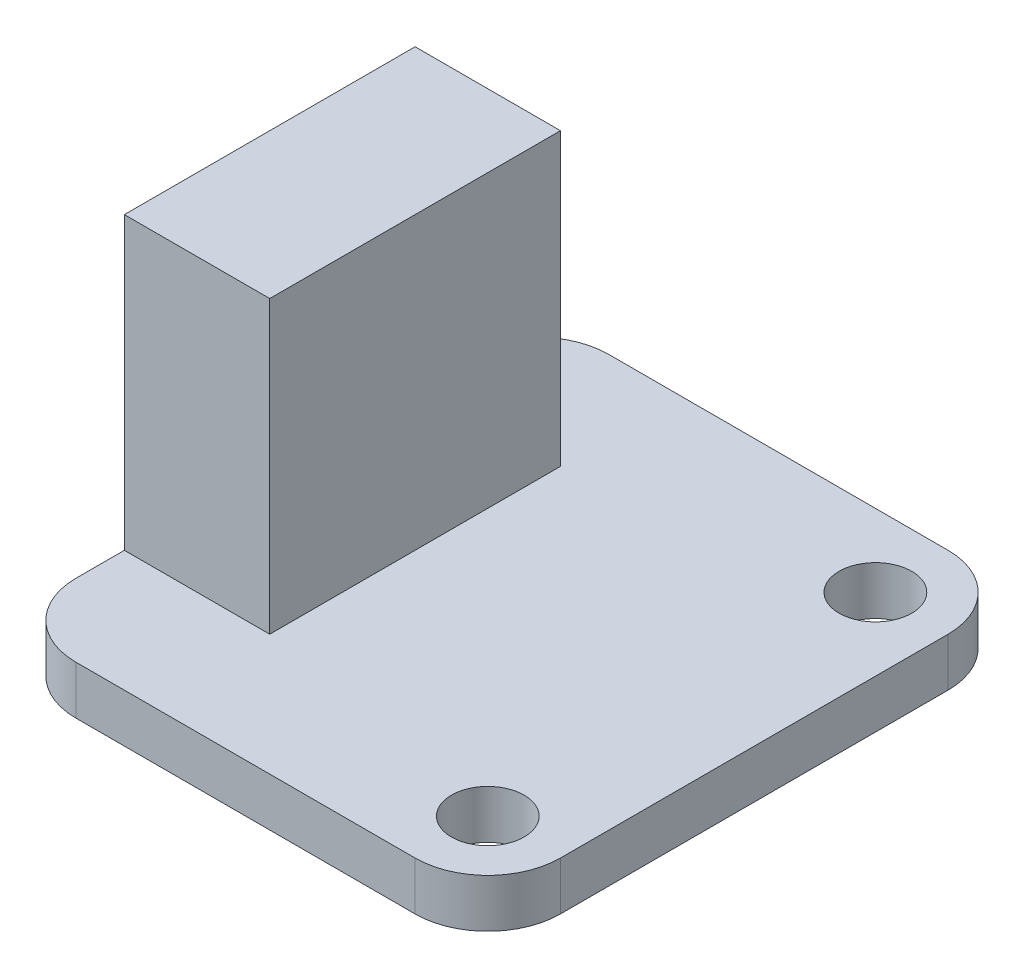
ISO-10303-21;
HEADER;
FILE_DESCRIPTION(('STEP AP214'),'2;1');
FILE_NAME('part.step','',(''),(''),'','','');
FILE_SCHEMA(('AUTOMOTIVE_DESIGN { 1 0 10303 214 1 1 1 1 }'));
ENDSEC;
DATA;
#1=APPLICATION_CONTEXT('core data for automotive mechanical design processes');
#2=APPLICATION_PROTOCOL_DEFINITION('international standard','automotive_design',2000,#1);
#3=PRODUCT_CONTEXT('',#1,'mechanical');
#4=PRODUCT('Part','Part','',(#3));
#5=PRODUCT_RELATED_PRODUCT_CATEGORY('part','',(#4));
#6=PRODUCT_DEFINITION_FORMATION('','',#4);
#7=PRODUCT_DEFINITION_CONTEXT('part definition',#1,'design');
#8=PRODUCT_DEFINITION('design','',#6,#7);
#9=PRODUCT_DEFINITION_SHAPE('','',#8);
#10=(LENGTH_UNIT() NAMED_UNIT(*) SI_UNIT(.MILLI.,.METRE.));
#11=(NAMED_UNIT(*) PLANE_ANGLE_UNIT() SI_UNIT($,.RADIAN.));
#12=(NAMED_UNIT(*) SI_UNIT($,.STERADIAN.) SOLID_ANGLE_UNIT());
#13=UNCERTAINTY_MEASURE_WITH_UNIT(LENGTH_MEASURE(1.E-05),#10,'distance_accuracy_value','');
#14=(GEOMETRIC_REPRESENTATION_CONTEXT(3) GLOBAL_UNCERTAINTY_ASSIGNED_CONTEXT((#13)) GLOBAL_UNIT_ASSIGNED_CONTEXT((#10,
#11,#12)) REPRESENTATION_CONTEXT('',''));
#15=CARTESIAN_POINT('',(0.,0.,0.));
#16=DIRECTION('',(0.,0.,1.));
#17=DIRECTION('',(1.,0.,0.));
#18=AXIS2_PLACEMENT_3D('',#15,#16,#17);
#19=CARTESIAN_POINT('',(7.00000000000002,0.,-8.));
#20=DIRECTION('',(0.,1.,0.));
#21=DIRECTION('',(0.,0.,1.));
#22=AXIS2_PLACEMENT_3D('',#19,#20,#21);
#23=PLANE('',#22);
#24=CARTESIAN_POINT('',(7.00000000000001,0.,8.));
#25=DIRECTION('',(0.,1.,0.));
#26=DIRECTION('',(0.,0.,1.));
#27=AXIS2_PLACEMENT_3D('',#24,#25,#26);
#28=CIRCLE('',#27,1.50000000000002);
#29=CARTESIAN_POINT('',(7.00000000000001,0.,9.50000000000003));
#30=VERTEX_POINT('',#29);
#31=EDGE_CURVE('E204',#30,#30,#28,.T.);
#32=ORIENTED_EDGE('',*,*,#31,.T.);
#33=EDGE_LOOP('',(#32));
#34=FACE_BOUND('',#33,.T.);
#35=CARTESIAN_POINT('',(7.00000000000001,0.,-8.));
#36=DIRECTION('',(0.,1.,0.));
#37=DIRECTION('',(0.,0.,1.));
#38=AXIS2_PLACEMENT_3D('',#35,#36,#37);
#39=CIRCLE('',#38,1.50000000000002);
#40=CARTESIAN_POINT('',(7.00000000000001,0.,-6.49999999999997));
#41=VERTEX_POINT('',#40);
#42=EDGE_CURVE('E208',#41,#41,#39,.T.);
#43=ORIENTED_EDGE('',*,*,#42,.T.);
#44=EDGE_LOOP('',(#43));
#45=FACE_BOUND('',#44,.T.);
#46=CARTESIAN_POINT('',(7.00000000000002,0.,-8.));
#47=DIRECTION('',(0.,1.,0.));
#48=DIRECTION('',(0.,0.,1.));
#49=AXIS2_PLACEMENT_3D('',#46,#47,#48);
#50=CIRCLE('',#49,3.);
#51=CARTESIAN_POINT('',(10.,0.,-7.99999999999998));
#52=VERTEX_POINT('',#51);
#53=CARTESIAN_POINT('',(7.,0.,-11.));
#54=VERTEX_POINT('',#53);
#55=EDGE_CURVE('E214',#52,#54,#50,.T.);
#56=ORIENTED_EDGE('',*,*,#55,.F.);
#57=DIRECTION('',(0.,0.,-1.));
#58=VECTOR('',#57,1.);
#59=CARTESIAN_POINT('',(10.,0.,-7.99999999999998));
#60=LINE('',#59,#58);
#61=CARTESIAN_POINT('',(10.0000000000001,0.,7.99999999999997));
#62=VERTEX_POINT('',#61);
#63=EDGE_CURVE('E221',#62,#52,#60,.T.);
#64=ORIENTED_EDGE('',*,*,#63,.F.);
#65=CARTESIAN_POINT('',(7.00000000000006,0.,8.));
#66=DIRECTION('',(0.,1.,0.));
#67=DIRECTION('',(0.,0.,1.));
#68=AXIS2_PLACEMENT_3D('',#65,#66,#67);
#69=CIRCLE('',#68,3.);
#70=CARTESIAN_POINT('',(7.00000000000003,0.,11.));
#71=VERTEX_POINT('',#70);
#72=EDGE_CURVE('E249',#71,#62,#69,.T.);
#73=ORIENTED_EDGE('',*,*,#72,.F.);
#74=DIRECTION('',(1.,0.,0.));
#75=VECTOR('',#74,1.);
#76=CARTESIAN_POINT('',(-6.99999999999999,0.,11.));
#77=LINE('',#76,#75);
#78=CARTESIAN_POINT('',(-6.99999999999999,0.,11.));
#79=VERTEX_POINT('',#78);
#80=EDGE_CURVE('E247',#79,#71,#77,.T.);
#81=ORIENTED_EDGE('',*,*,#80,.F.);
#82=CARTESIAN_POINT('',(-7.00000000000001,0.,8.));
#83=DIRECTION('',(0.,1.,0.));
#84=DIRECTION('',(0.,0.,1.));
#85=AXIS2_PLACEMENT_3D('',#82,#83,#84);
#86=CIRCLE('',#85,3.);
#87=CARTESIAN_POINT('',(-10.,0.,7.99999999999998));
#88=VERTEX_POINT('',#87);
#89=EDGE_CURVE('E245',#88,#79,#86,.T.);
#90=ORIENTED_EDGE('',*,*,#89,.F.);
#91=DIRECTION('',(0.,0.,1.));
#92=VECTOR('',#91,1.);
#93=CARTESIAN_POINT('',(-10.,0.,-7.99999999999997));
#94=LINE('',#93,#92);
#95=CARTESIAN_POINT('',(-10.,0.,-7.99999999999997));
#96=VERTEX_POINT('',#95);
#97=EDGE_CURVE('E243',#96,#88,#94,.T.);
#98=ORIENTED_EDGE('',*,*,#97,.F.);
#99=CARTESIAN_POINT('',(-7.00000000000001,0.,-8.));
#100=DIRECTION('',(0.,1.,0.));
#101=DIRECTION('',(0.,0.,1.));
#102=AXIS2_PLACEMENT_3D('',#99,#100,#101);
#103=CIRCLE('',#102,3.);
#104=CARTESIAN_POINT('',(-6.99999999999999,0.,-11.));
#105=VERTEX_POINT('',#104);
#106=EDGE_CURVE('E241',#105,#96,#103,.T.);
#107=ORIENTED_EDGE('',*,*,#106,.F.);
#108=DIRECTION('',(-1.,0.,0.));
#109=VECTOR('',#108,1.);
#110=CARTESIAN_POINT('',(-6.99999999999999,0.,-11.));
#111=LINE('',#110,#109);
#112=EDGE_CURVE('E239',#54,#105,#111,.T.);
#113=ORIENTED_EDGE('',*,*,#112,.F.);
#114=EDGE_LOOP('',(#56,#64,#73,#81,#90,#98,#107,#113));
#115=FACE_BOUND('',#114,.T.);
#116=DIRECTION('',(0.,0.,1.));
#117=VECTOR('',#116,1.);
#118=CARTESIAN_POINT('',(3.00000000000006,0.,2.));
#119=LINE('',#118,#117);
#120=CARTESIAN_POINT('',(3.00000000000006,0.,-2.));
#121=VERTEX_POINT('',#120);
#122=CARTESIAN_POINT('',(3.00000000000006,0.,2.));
#123=VERTEX_POINT('',#122);
#124=EDGE_CURVE('E168',#121,#123,#119,.T.);
#125=ORIENTED_EDGE('',*,*,#124,.F.);
#126=DIRECTION('',(1.,0.,0.));
#127=VECTOR('',#126,1.);
#128=CARTESIAN_POINT('',(1.00000000000006,0.,-2.));
#129=LINE('',#128,#127);
#130=CARTESIAN_POINT('',(1.00000000000006,0.,-2.));
#131=VERTEX_POINT('',#130);
#132=EDGE_CURVE('E165',#131,#121,#129,.T.);
#133=ORIENTED_EDGE('',*,*,#132,.F.);
#134=DIRECTION('',(0.,0.,-1.));
#135=VECTOR('',#134,1.);
#136=CARTESIAN_POINT('',(1.00000000000006,0.,2.));
#137=LINE('',#136,#135);
#138=CARTESIAN_POINT('',(1.00000000000006,0.,2.));
#139=VERTEX_POINT('',#138);
#140=EDGE_CURVE('E55',#139,#131,#137,.T.);
#141=ORIENTED_EDGE('',*,*,#140,.F.);
#142=DIRECTION('',(-1.,0.,0.));
#143=VECTOR('',#142,1.);
#144=CARTESIAN_POINT('',(1.00000000000006,0.,2.));
#145=LINE('',#144,#143);
#146=EDGE_CURVE('E50',#123,#139,#145,.T.);
#147=ORIENTED_EDGE('',*,*,#146,.F.);
#148=EDGE_LOOP('',(#125,#133,#141,#147));
#149=FACE_BOUND('',#148,.T.);
#150=ADVANCED_FACE('F35',(#34,#45,#115,#149),#23,.F.);
#151=CARTESIAN_POINT('',(7.00000000000002,2.,-8.));
#152=DIRECTION('',(0.,1.,0.));
#153=DIRECTION('',(0.,0.,1.));
#154=AXIS2_PLACEMENT_3D('',#151,#152,#153);
#155=PLANE('',#154);
#156=DIRECTION('',(1.,0.,0.));
#157=VECTOR('',#156,1.);
#158=CARTESIAN_POINT('',(-10.,2.,6.));
#159=LINE('',#158,#157);
#160=CARTESIAN_POINT('',(-10.,2.,6.));
#161=VERTEX_POINT('',#160);
#162=CARTESIAN_POINT('',(-4.00000000000001,2.,6.));
#163=VERTEX_POINT('',#162);
#164=EDGE_CURVE('E182',#161,#163,#159,.T.);
#165=ORIENTED_EDGE('',*,*,#164,.F.);
#166=DIRECTION('',(0.,0.,1.));
#167=VECTOR('',#166,1.);
#168=CARTESIAN_POINT('',(-10.,2.,-7.99999999999997));
#169=LINE('',#168,#167);
#170=CARTESIAN_POINT('',(-10.,2.,7.99999999999998));
#171=VERTEX_POINT('',#170);
#172=EDGE_CURVE('E225',#161,#171,#169,.T.);
#173=ORIENTED_EDGE('',*,*,#172,.T.);
#174=CARTESIAN_POINT('',(-7.00000000000001,2.,8.));
#175=DIRECTION('',(0.,1.,0.));
#176=DIRECTION('',(0.,0.,1.));
#177=AXIS2_PLACEMENT_3D('',#174,#175,#176);
#178=CIRCLE('',#177,3.);
#179=CARTESIAN_POINT('',(-6.99999999999999,2.,11.));
#180=VERTEX_POINT('',#179);
#181=EDGE_CURVE('E228',#171,#180,#178,.T.);
#182=ORIENTED_EDGE('',*,*,#181,.T.);
#183=DIRECTION('',(1.,0.,0.));
#184=VECTOR('',#183,1.);
#185=CARTESIAN_POINT('',(-6.99999999999999,2.,11.));
#186=LINE('',#185,#184);
#187=CARTESIAN_POINT('',(7.00000000000003,2.,11.));
#188=VERTEX_POINT('',#187);
#189=EDGE_CURVE('E230',#180,#188,#186,.T.);
#190=ORIENTED_EDGE('',*,*,#189,.T.);
#191=CARTESIAN_POINT('',(7.00000000000006,2.,8.));
#192=DIRECTION('',(0.,1.,0.));
#193=DIRECTION('',(0.,0.,1.));
#194=AXIS2_PLACEMENT_3D('',#191,#192,#193);
#195=CIRCLE('',#194,3.);
#196=CARTESIAN_POINT('',(10.0000000000001,2.,7.99999999999997));
#197=VERTEX_POINT('',#196);
#198=EDGE_CURVE('E232',#188,#197,#195,.T.);
#199=ORIENTED_EDGE('',*,*,#198,.T.);
#200=DIRECTION('',(0.,0.,-1.));
#201=VECTOR('',#200,1.);
#202=CARTESIAN_POINT('',(10.,2.,-7.99999999999998));
#203=LINE('',#202,#201);
#204=CARTESIAN_POINT('',(10.,2.,-7.99999999999998));
#205=VERTEX_POINT('',#204);
#206=EDGE_CURVE('E234',#197,#205,#203,.T.);
#207=ORIENTED_EDGE('',*,*,#206,.T.);
#208=CARTESIAN_POINT('',(7.00000000000002,2.,-8.));
#209=DIRECTION('',(0.,1.,0.));
#210=DIRECTION('',(0.,0.,1.));
#211=AXIS2_PLACEMENT_3D('',#208,#209,#210);
#212=CIRCLE('',#211,3.);
#213=CARTESIAN_POINT('',(7.,2.,-11.));
#214=VERTEX_POINT('',#213);
#215=EDGE_CURVE('E217',#205,#214,#212,.T.);
#216=ORIENTED_EDGE('',*,*,#215,.T.);
#217=DIRECTION('',(-1.,0.,0.));
#218=VECTOR('',#217,1.);
#219=CARTESIAN_POINT('',(-6.99999999999999,2.,-11.));
#220=LINE('',#219,#218);
#221=CARTESIAN_POINT('',(-6.99999999999999,2.,-11.));
#222=VERTEX_POINT('',#221);
#223=EDGE_CURVE('E220',#214,#222,#220,.T.);
#224=ORIENTED_EDGE('',*,*,#223,.T.);
#225=CARTESIAN_POINT('',(-7.00000000000001,2.,-8.));
#226=DIRECTION('',(0.,1.,0.));
#227=DIRECTION('',(0.,0.,1.));
#228=AXIS2_PLACEMENT_3D('',#225,#226,#227);
#229=CIRCLE('',#228,3.);
#230=CARTESIAN_POINT('',(-10.,2.,-7.99999999999997));
#231=VERTEX_POINT('',#230);
#232=EDGE_CURVE('E223',#222,#231,#229,.T.);
#233=ORIENTED_EDGE('',*,*,#232,.T.);
#234=CARTESIAN_POINT('',(-10.,2.,-6.));
#235=VERTEX_POINT('',#234);
#236=EDGE_CURVE('E226',#231,#235,#169,.T.);
#237=ORIENTED_EDGE('',*,*,#236,.T.);
#238=DIRECTION('',(-1.,0.,0.));
#239=VECTOR('',#238,1.);
#240=CARTESIAN_POINT('',(-10.,2.,-6.));
#241=LINE('',#240,#239);
#242=CARTESIAN_POINT('',(-4.00000000000001,2.,-6.));
#243=VERTEX_POINT('',#242);
#244=EDGE_CURVE('E172',#243,#235,#241,.T.);
#245=ORIENTED_EDGE('',*,*,#244,.F.);
#246=DIRECTION('',(0.,0.,-1.));
#247=VECTOR('',#246,1.);
#248=CARTESIAN_POINT('',(-4.00000000000001,2.,-6.));
#249=LINE('',#248,#247);
#250=EDGE_CURVE('E169',#163,#243,#249,.T.);
#251=ORIENTED_EDGE('',*,*,#250,.F.);
#252=EDGE_LOOP('',(#165,#173,#182,#190,#199,#207,#216,#224,#233,#237,#245,#251));
#253=FACE_BOUND('',#252,.T.);
#254=CARTESIAN_POINT('',(7.00000000000001,2.,-8.));
#255=DIRECTION('',(0.,1.,0.));
#256=DIRECTION('',(0.,0.,1.));
#257=AXIS2_PLACEMENT_3D('',#254,#255,#256);
#258=CIRCLE('',#257,1.50000000000002);
#259=CARTESIAN_POINT('',(7.00000000000001,2.,-6.49999999999997));
#260=VERTEX_POINT('',#259);
#261=EDGE_CURVE('E211',#260,#260,#258,.T.);
#262=ORIENTED_EDGE('',*,*,#261,.F.);
#263=EDGE_LOOP('',(#262));
#264=FACE_BOUND('',#263,.T.);
#265=CARTESIAN_POINT('',(7.00000000000001,2.,8.));
#266=DIRECTION('',(0.,1.,0.));
#267=DIRECTION('',(0.,0.,1.));
#268=AXIS2_PLACEMENT_3D('',#265,#266,#267);
#269=CIRCLE('',#268,1.50000000000002);
#270=CARTESIAN_POINT('',(7.00000000000001,2.,9.50000000000003));
#271=VERTEX_POINT('',#270);
#272=EDGE_CURVE('E205',#271,#271,#269,.T.);
#273=ORIENTED_EDGE('',*,*,#272,.F.);
#274=EDGE_LOOP('',(#273));
#275=FACE_BOUND('',#274,.T.);
#276=ADVANCED_FACE('F292',(#253,#264,#275),#155,.T.);
#277=CARTESIAN_POINT('',(7.00000000000002,2.,-8.));
#278=DIRECTION('',(0.,-1.,0.));
#279=DIRECTION('',(0.,0.,-1.));
#280=AXIS2_PLACEMENT_3D('',#277,#278,#279);
#281=CYLINDRICAL_SURFACE('',#280,3.);
#282=ORIENTED_EDGE('',*,*,#55,.T.);
#283=DIRECTION('',(0.,-1.,0.));
#284=VECTOR('',#283,1.);
#285=CARTESIAN_POINT('',(7.,2.,-11.));
#286=LINE('',#285,#284);
#287=EDGE_CURVE('E11',#214,#54,#286,.T.);
#288=ORIENTED_EDGE('',*,*,#287,.F.);
#289=ORIENTED_EDGE('',*,*,#215,.F.);
#290=DIRECTION('',(0.,-1.,0.));
#291=VECTOR('',#290,1.);
#292=CARTESIAN_POINT('',(10.,2.,-7.99999999999998));
#293=LINE('',#292,#291);
#294=EDGE_CURVE('E236',#205,#52,#293,.T.);
#295=ORIENTED_EDGE('',*,*,#294,.T.);
#296=EDGE_LOOP('',(#282,#288,#289,#295));
#297=FACE_BOUND('',#296,.T.);
#298=ADVANCED_FACE('F37',(#297),#281,.T.);
#299=CARTESIAN_POINT('',(-6.99999999999999,2.,-11.));
#300=DIRECTION('',(0.,0.,1.));
#301=DIRECTION('',(1.,0.,0.));
#302=AXIS2_PLACEMENT_3D('',#299,#300,#301);
#303=PLANE('',#302);
#304=ORIENTED_EDGE('',*,*,#112,.T.);
#305=DIRECTION('',(0.,-1.,0.));
#306=VECTOR('',#305,1.);
#307=CARTESIAN_POINT('',(-6.99999999999999,2.,-11.));
#308=LINE('',#307,#306);
#309=EDGE_CURVE('E43',#222,#105,#308,.T.);
#310=ORIENTED_EDGE('',*,*,#309,.F.);
#311=ORIENTED_EDGE('',*,*,#223,.F.);
#312=ORIENTED_EDGE('',*,*,#287,.T.);
#313=EDGE_LOOP('',(#304,#310,#311,#312));
#314=FACE_BOUND('',#313,.T.);
#315=ADVANCED_FACE('F310',(#314),#303,.F.);
#316=CARTESIAN_POINT('',(-7.00000000000001,2.,-8.));
#317=DIRECTION('',(0.,-1.,0.));
#318=DIRECTION('',(0.,0.,-1.));
#319=AXIS2_PLACEMENT_3D('',#316,#317,#318);
#320=CYLINDRICAL_SURFACE('',#319,3.);
#321=ORIENTED_EDGE('',*,*,#106,.T.);
#322=DIRECTION('',(0.,-1.,0.));
#323=VECTOR('',#322,1.);
#324=CARTESIAN_POINT('',(-10.,2.,-7.99999999999997));
#325=LINE('',#324,#323);
#326=EDGE_CURVE('E266',#231,#96,#325,.T.);
#327=ORIENTED_EDGE('',*,*,#326,.F.);
#328=ORIENTED_EDGE('',*,*,#232,.F.);
#329=ORIENTED_EDGE('',*,*,#309,.T.);
#330=EDGE_LOOP('',(#321,#327,#328,#329));
#331=FACE_BOUND('',#330,.T.);
#332=ADVANCED_FACE('F273',(#331),#320,.T.);
#333=CARTESIAN_POINT('',(-10.,2.,-7.99999999999997));
#334=DIRECTION('',(1.,0.,0.));
#335=DIRECTION('',(0.,0.,-1.));
#336=AXIS2_PLACEMENT_3D('',#333,#334,#335);
#337=PLANE('',#336);
#338=ORIENTED_EDGE('',*,*,#97,.T.);
#339=DIRECTION('',(0.,-1.,0.));
#340=VECTOR('',#339,1.);
#341=CARTESIAN_POINT('',(-10.,2.,7.99999999999998));
#342=LINE('',#341,#340);
#343=EDGE_CURVE('E263',#171,#88,#342,.T.);
#344=ORIENTED_EDGE('',*,*,#343,.F.);
#345=ORIENTED_EDGE('',*,*,#172,.F.);
#346=DIRECTION('',(0.,-1.,0.));
#347=VECTOR('',#346,1.);
#348=CARTESIAN_POINT('',(-10.,14.,6.));
#349=LINE('',#348,#347);
#350=CARTESIAN_POINT('',(-10.,14.,6.));
#351=VERTEX_POINT('',#350);
#352=EDGE_CURVE('E195',#351,#161,#349,.T.);
#353=ORIENTED_EDGE('',*,*,#352,.F.);
#354=DIRECTION('',(0.,0.,1.));
#355=VECTOR('',#354,1.);
#356=CARTESIAN_POINT('',(-10.,14.,-6.));
#357=LINE('',#356,#355);
#358=CARTESIAN_POINT('',(-10.,14.,-6.));
#359=VERTEX_POINT('',#358);
#360=EDGE_CURVE('E184',#359,#351,#357,.T.);
#361=ORIENTED_EDGE('',*,*,#360,.F.);
#362=DIRECTION('',(0.,-1.,0.));
#363=VECTOR('',#362,1.);
#364=CARTESIAN_POINT('',(-10.,14.,-6.));
#365=LINE('',#364,#363);
#366=EDGE_CURVE('E198',#359,#235,#365,.T.);
#367=ORIENTED_EDGE('',*,*,#366,.T.);
#368=ORIENTED_EDGE('',*,*,#236,.F.);
#369=ORIENTED_EDGE('',*,*,#326,.T.);
#370=EDGE_LOOP('',(#338,#344,#345,#353,#361,#367,#368,#369));
#371=FACE_BOUND('',#370,.T.);
#372=ADVANCED_FACE('F283',(#371),#337,.F.);
#373=CARTESIAN_POINT('',(-7.00000000000001,2.,8.));
#374=DIRECTION('',(0.,-1.,0.));
#375=DIRECTION('',(0.,0.,-1.));
#376=AXIS2_PLACEMENT_3D('',#373,#374,#375);
#377=CYLINDRICAL_SURFACE('',#376,3.);
#378=ORIENTED_EDGE('',*,*,#89,.T.);
#379=DIRECTION('',(0.,-1.,0.));
#380=VECTOR('',#379,1.);
#381=CARTESIAN_POINT('',(-6.99999999999999,2.,11.));
#382=LINE('',#381,#380);
#383=EDGE_CURVE('E260',#180,#79,#382,.T.);
#384=ORIENTED_EDGE('',*,*,#383,.F.);
#385=ORIENTED_EDGE('',*,*,#181,.F.);
#386=ORIENTED_EDGE('',*,*,#343,.T.);
#387=EDGE_LOOP('',(#378,#384,#385,#386));
#388=FACE_BOUND('',#387,.T.);
#389=ADVANCED_FACE('F288',(#388),#377,.T.);
#390=CARTESIAN_POINT('',(-6.99999999999999,2.,11.));
#391=DIRECTION('',(0.,0.,-1.));
#392=DIRECTION('',(-1.,0.,0.));
#393=AXIS2_PLACEMENT_3D('',#390,#391,#392);
#394=PLANE('',#393);
#395=ORIENTED_EDGE('',*,*,#80,.T.);
#396=DIRECTION('',(0.,-1.,0.));
#397=VECTOR('',#396,1.);
#398=CARTESIAN_POINT('',(7.00000000000003,2.,11.));
#399=LINE('',#398,#397);
#400=EDGE_CURVE('E257',#188,#71,#399,.T.);
#401=ORIENTED_EDGE('',*,*,#400,.F.);
#402=ORIENTED_EDGE('',*,*,#189,.F.);
#403=ORIENTED_EDGE('',*,*,#383,.T.);
#404=EDGE_LOOP('',(#395,#401,#402,#403));
#405=FACE_BOUND('',#404,.T.);
#406=ADVANCED_FACE('F323',(#405),#394,.F.);
#407=CARTESIAN_POINT('',(7.00000000000006,2.,8.));
#408=DIRECTION('',(0.,-1.,0.));
#409=DIRECTION('',(0.,0.,-1.));
#410=AXIS2_PLACEMENT_3D('',#407,#408,#409);
#411=CYLINDRICAL_SURFACE('',#410,3.);
#412=ORIENTED_EDGE('',*,*,#72,.T.);
#413=DIRECTION('',(0.,-1.,0.));
#414=VECTOR('',#413,1.);
#415=CARTESIAN_POINT('',(10.0000000000001,2.,7.99999999999997));
#416=LINE('',#415,#414);
#417=EDGE_CURVE('E254',#197,#62,#416,.T.);
#418=ORIENTED_EDGE('',*,*,#417,.F.);
#419=ORIENTED_EDGE('',*,*,#198,.F.);
#420=ORIENTED_EDGE('',*,*,#400,.T.);
#421=EDGE_LOOP('',(#412,#418,#419,#420));
#422=FACE_BOUND('',#421,.T.);
#423=ADVANCED_FACE('F321',(#422),#411,.T.);
#424=CARTESIAN_POINT('',(10.,2.,-7.99999999999998));
#425=DIRECTION('',(-1.,0.,0.));
#426=DIRECTION('',(0.,0.,1.));
#427=AXIS2_PLACEMENT_3D('',#424,#425,#426);
#428=PLANE('',#427);
#429=ORIENTED_EDGE('',*,*,#63,.T.);
#430=ORIENTED_EDGE('',*,*,#294,.F.);
#431=ORIENTED_EDGE('',*,*,#206,.F.);
#432=ORIENTED_EDGE('',*,*,#417,.T.);
#433=EDGE_LOOP('',(#429,#430,#431,#432));
#434=FACE_BOUND('',#433,.T.);
#435=ADVANCED_FACE('F316',(#434),#428,.F.);
#436=CARTESIAN_POINT('',(7.00000000000001,2.,-8.));
#437=DIRECTION('',(0.,-1.,0.));
#438=DIRECTION('',(0.,0.,-1.));
#439=AXIS2_PLACEMENT_3D('',#436,#437,#438);
#440=CYLINDRICAL_SURFACE('',#439,1.50000000000002);
#441=ORIENTED_EDGE('',*,*,#261,.T.);
#442=EDGE_LOOP('',(#441));
#443=FACE_BOUND('',#442,.T.);
#444=ORIENTED_EDGE('',*,*,#42,.F.);
#445=EDGE_LOOP('',(#444));
#446=FACE_BOUND('',#445,.T.);
#447=ADVANCED_FACE('F343',(#443,#446),#440,.F.);
#448=CARTESIAN_POINT('',(7.00000000000001,2.,8.));
#449=DIRECTION('',(0.,-1.,0.));
#450=DIRECTION('',(0.,0.,-1.));
#451=AXIS2_PLACEMENT_3D('',#448,#449,#450);
#452=CYLINDRICAL_SURFACE('',#451,1.50000000000002);
#453=ORIENTED_EDGE('',*,*,#272,.T.);
#454=EDGE_LOOP('',(#453));
#455=FACE_BOUND('',#454,.T.);
#456=ORIENTED_EDGE('',*,*,#31,.F.);
#457=EDGE_LOOP('',(#456));
#458=FACE_BOUND('',#457,.T.);
#459=ADVANCED_FACE('F347',(#455,#458),#452,.F.);
#460=CARTESIAN_POINT('',(-4.00000000000001,14.,-6.));
#461=DIRECTION('',(-1.,0.,0.));
#462=DIRECTION('',(0.,0.,1.));
#463=AXIS2_PLACEMENT_3D('',#460,#461,#462);
#464=PLANE('',#463);
#465=ORIENTED_EDGE('',*,*,#250,.T.);
#466=DIRECTION('',(0.,-1.,0.));
#467=VECTOR('',#466,1.);
#468=CARTESIAN_POINT('',(-4.00000000000001,14.,-6.));
#469=LINE('',#468,#467);
#470=CARTESIAN_POINT('',(-4.00000000000001,14.,-6.));
#471=VERTEX_POINT('',#470);
#472=EDGE_CURVE('E201',#471,#243,#469,.T.);
#473=ORIENTED_EDGE('',*,*,#472,.F.);
#474=DIRECTION('',(0.,0.,-1.));
#475=VECTOR('',#474,1.);
#476=CARTESIAN_POINT('',(-4.00000000000001,14.,-6.));
#477=LINE('',#476,#475);
#478=CARTESIAN_POINT('',(-4.00000000000001,14.,6.));
#479=VERTEX_POINT('',#478);
#480=EDGE_CURVE('E178',#479,#471,#477,.T.);
#481=ORIENTED_EDGE('',*,*,#480,.F.);
#482=DIRECTION('',(0.,-1.,0.));
#483=VECTOR('',#482,1.);
#484=CARTESIAN_POINT('',(-4.00000000000001,14.,6.));
#485=LINE('',#484,#483);
#486=EDGE_CURVE('E187',#479,#163,#485,.T.);
#487=ORIENTED_EDGE('',*,*,#486,.T.);
#488=EDGE_LOOP('',(#465,#473,#481,#487));
#489=FACE_BOUND('',#488,.T.);
#490=ADVANCED_FACE('F352',(#489),#464,.F.);
#491=CARTESIAN_POINT('',(-10.,14.,-6.));
#492=DIRECTION('',(0.,0.,1.));
#493=DIRECTION('',(1.,0.,0.));
#494=AXIS2_PLACEMENT_3D('',#491,#492,#493);
#495=PLANE('',#494);
#496=ORIENTED_EDGE('',*,*,#244,.T.);
#497=ORIENTED_EDGE('',*,*,#366,.F.);
#498=DIRECTION('',(-1.,0.,0.));
#499=VECTOR('',#498,1.);
#500=CARTESIAN_POINT('',(-10.,14.,-6.));
#501=LINE('',#500,#499);
#502=EDGE_CURVE('E181',#471,#359,#501,.T.);
#503=ORIENTED_EDGE('',*,*,#502,.F.);
#504=ORIENTED_EDGE('',*,*,#472,.T.);
#505=EDGE_LOOP('',(#496,#497,#503,#504));
#506=FACE_BOUND('',#505,.T.);
#507=ADVANCED_FACE('F307',(#506),#495,.F.);
#508=CARTESIAN_POINT('',(-10.,14.,6.));
#509=DIRECTION('',(0.,0.,-1.));
#510=DIRECTION('',(-1.,0.,0.));
#511=AXIS2_PLACEMENT_3D('',#508,#509,#510);
#512=PLANE('',#511);
#513=ORIENTED_EDGE('',*,*,#164,.T.);
#514=ORIENTED_EDGE('',*,*,#486,.F.);
#515=DIRECTION('',(1.,0.,0.));
#516=VECTOR('',#515,1.);
#517=CARTESIAN_POINT('',(-10.,14.,6.));
#518=LINE('',#517,#516);
#519=EDGE_CURVE('E186',#351,#479,#518,.T.);
#520=ORIENTED_EDGE('',*,*,#519,.F.);
#521=ORIENTED_EDGE('',*,*,#352,.T.);
#522=EDGE_LOOP('',(#513,#514,#520,#521));
#523=FACE_BOUND('',#522,.T.);
#524=ADVANCED_FACE('F299',(#523),#512,.F.);
#525=CARTESIAN_POINT('',(0.,14.,0.));
#526=DIRECTION('',(0.,1.,0.));
#527=DIRECTION('',(0.,0.,1.));
#528=AXIS2_PLACEMENT_3D('',#525,#526,#527);
#529=PLANE('',#528);
#530=ORIENTED_EDGE('',*,*,#480,.T.);
#531=ORIENTED_EDGE('',*,*,#502,.T.);
#532=ORIENTED_EDGE('',*,*,#360,.T.);
#533=ORIENTED_EDGE('',*,*,#519,.T.);
#534=EDGE_LOOP('',(#530,#531,#532,#533));
#535=FACE_BOUND('',#534,.T.);
#536=ADVANCED_FACE('F303',(#535),#529,.T.);
#537=CARTESIAN_POINT('',(3.00000000000006,-2.,2.));
#538=DIRECTION('',(-1.,0.,0.));
#539=DIRECTION('',(0.,0.,1.));
#540=AXIS2_PLACEMENT_3D('',#537,#538,#539);
#541=PLANE('',#540);
#542=ORIENTED_EDGE('',*,*,#124,.T.);
#543=DIRECTION('',(0.,1.,0.));
#544=VECTOR('',#543,1.);
#545=CARTESIAN_POINT('',(3.00000000000006,-2.,2.));
#546=LINE('',#545,#544);
#547=CARTESIAN_POINT('',(3.00000000000006,-2.,2.));
#548=VERTEX_POINT('',#547);
#549=EDGE_CURVE('E149',#548,#123,#546,.T.);
#550=ORIENTED_EDGE('',*,*,#549,.F.);
#551=DIRECTION('',(0.,0.,1.));
#552=VECTOR('',#551,1.);
#553=CARTESIAN_POINT('',(3.00000000000006,-2.,2.));
#554=LINE('',#553,#552);
#555=CARTESIAN_POINT('',(3.00000000000006,-2.,-2.));
#556=VERTEX_POINT('',#555);
#557=EDGE_CURVE('E156',#556,#548,#554,.T.);
#558=ORIENTED_EDGE('',*,*,#557,.F.);
#559=DIRECTION('',(0.,1.,0.));
#560=VECTOR('',#559,1.);
#561=CARTESIAN_POINT('',(3.00000000000006,-2.,-2.));
#562=LINE('',#561,#560);
#563=EDGE_CURVE('E508',#556,#121,#562,.T.);
#564=ORIENTED_EDGE('',*,*,#563,.T.);
#565=EDGE_LOOP('',(#542,#550,#558,#564));
#566=FACE_BOUND('',#565,.T.);
#567=ADVANCED_FACE('F167',(#566),#541,.F.);
#568=CARTESIAN_POINT('',(1.00000000000006,-2.,2.));
#569=DIRECTION('',(0.,0.,-1.));
#570=DIRECTION('',(-1.,0.,0.));
#571=AXIS2_PLACEMENT_3D('',#568,#569,#570);
#572=PLANE('',#571);
#573=ORIENTED_EDGE('',*,*,#146,.T.);
#574=DIRECTION('',(0.,1.,0.));
#575=VECTOR('',#574,1.);
#576=CARTESIAN_POINT('',(1.00000000000006,-2.,2.));
#577=LINE('',#576,#575);
#578=CARTESIAN_POINT('',(1.00000000000006,-2.,2.));
#579=VERTEX_POINT('',#578);
#580=EDGE_CURVE('E152',#579,#139,#577,.T.);
#581=ORIENTED_EDGE('',*,*,#580,.F.);
#582=DIRECTION('',(-1.,0.,0.));
#583=VECTOR('',#582,1.);
#584=CARTESIAN_POINT('',(1.00000000000006,-2.,2.));
#585=LINE('',#584,#583);
#586=EDGE_CURVE('E145',#548,#579,#585,.T.);
#587=ORIENTED_EDGE('',*,*,#586,.F.);
#588=ORIENTED_EDGE('',*,*,#549,.T.);
#589=EDGE_LOOP('',(#573,#581,#587,#588));
#590=FACE_BOUND('',#589,.T.);
#591=ADVANCED_FACE('F147',(#590),#572,.F.);
#592=CARTESIAN_POINT('',(1.00000000000006,-2.,2.));
#593=DIRECTION('',(1.,0.,0.));
#594=DIRECTION('',(0.,0.,-1.));
#595=AXIS2_PLACEMENT_3D('',#592,#593,#594);
#596=PLANE('',#595);
#597=ORIENTED_EDGE('',*,*,#140,.T.);
#598=DIRECTION('',(0.,1.,0.));
#599=VECTOR('',#598,1.);
#600=CARTESIAN_POINT('',(1.00000000000006,-2.,-2.));
#601=LINE('',#600,#599);
#602=CARTESIAN_POINT('',(1.00000000000006,-2.,-2.));
#603=VERTEX_POINT('',#602);
#604=EDGE_CURVE('E174',#603,#131,#601,.T.);
#605=ORIENTED_EDGE('',*,*,#604,.F.);
#606=DIRECTION('',(0.,0.,-1.));
#607=VECTOR('',#606,1.);
#608=CARTESIAN_POINT('',(1.00000000000006,-2.,2.));
#609=LINE('',#608,#607);
#610=EDGE_CURVE('E155',#579,#603,#609,.T.);
#611=ORIENTED_EDGE('',*,*,#610,.F.);
#612=ORIENTED_EDGE('',*,*,#580,.T.);
#613=EDGE_LOOP('',(#597,#605,#611,#612));
#614=FACE_BOUND('',#613,.T.);
#615=ADVANCED_FACE('F370',(#614),#596,.F.);
#616=CARTESIAN_POINT('',(1.00000000000006,-2.,-2.));
#617=DIRECTION('',(0.,0.,1.));
#618=DIRECTION('',(1.,0.,0.));
#619=AXIS2_PLACEMENT_3D('',#616,#617,#618);
#620=PLANE('',#619);
#621=ORIENTED_EDGE('',*,*,#132,.T.);
#622=ORIENTED_EDGE('',*,*,#563,.F.);
#623=DIRECTION('',(1.,0.,0.));
#624=VECTOR('',#623,1.);
#625=CARTESIAN_POINT('',(1.00000000000006,-2.,-2.));
#626=LINE('',#625,#624);
#627=EDGE_CURVE('E161',#603,#556,#626,.T.);
#628=ORIENTED_EDGE('',*,*,#627,.F.);
#629=ORIENTED_EDGE('',*,*,#604,.T.);
#630=EDGE_LOOP('',(#621,#622,#628,#629));
#631=FACE_BOUND('',#630,.T.);
#632=ADVANCED_FACE('F373',(#631),#620,.F.);
#633=CARTESIAN_POINT('',(0.,-2.,0.));
#634=DIRECTION('',(0.,-1.,0.));
#635=DIRECTION('',(0.,0.,-1.));
#636=AXIS2_PLACEMENT_3D('',#633,#634,#635);
#637=PLANE('',#636);
#638=ORIENTED_EDGE('',*,*,#557,.T.);
#639=ORIENTED_EDGE('',*,*,#586,.T.);
#640=ORIENTED_EDGE('',*,*,#610,.T.);
#641=ORIENTED_EDGE('',*,*,#627,.T.);
#642=EDGE_LOOP('',(#638,#639,#640,#641));
#643=FACE_BOUND('',#642,.T.);
#644=ADVANCED_FACE('F159',(#643),#637,.T.);
#645=CLOSED_SHELL('',(#150,#276,#298,#315,#332,#372,#389,#406,#423,#435,#447,#459,#490,#507,
#524,#536,#567,#591,#615,#632,#644));
#646=MANIFOLD_SOLID_BREP('B2',#645);
#647=ADVANCED_BREP_SHAPE_REPRESENTATION('',(#18,#646),#14);
#648=SHAPE_DEFINITION_REPRESENTATION(#9,#647);
ENDSEC;
END-ISO-10303-21;
